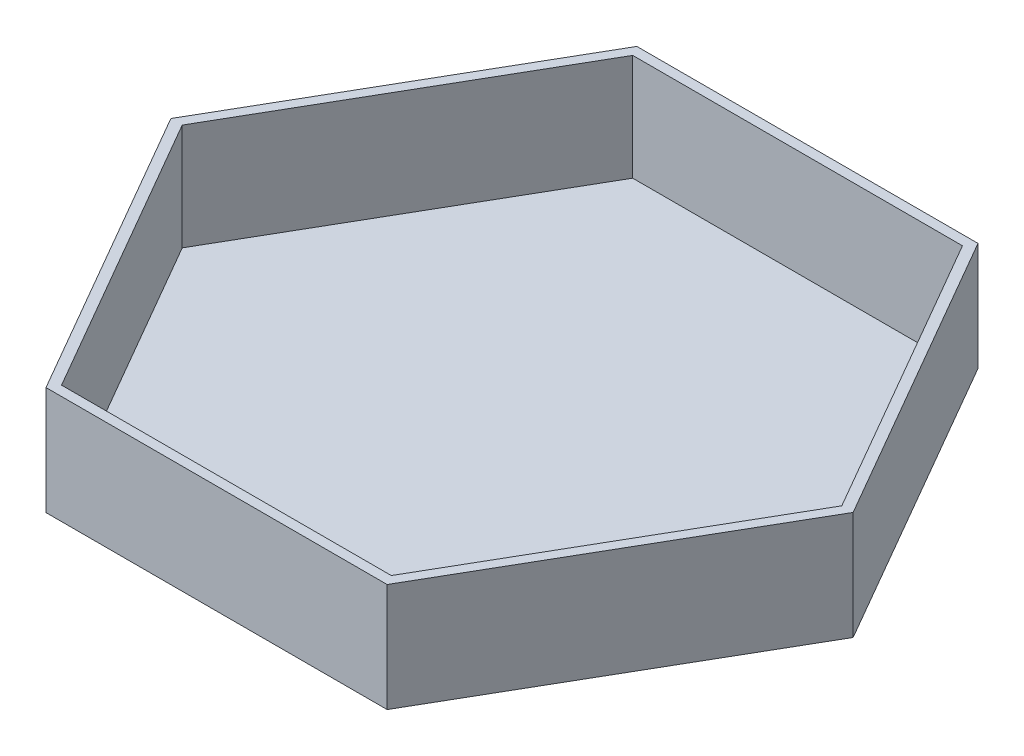
ISO-10303-21;
HEADER;
FILE_DESCRIPTION(('STEP AP214'),'2;1');
FILE_NAME('part.step','',(''),(''),'','','');
FILE_SCHEMA(('AUTOMOTIVE_DESIGN { 1 0 10303 214 1 1 1 1 }'));
ENDSEC;
DATA;
#1=APPLICATION_CONTEXT('core data for automotive mechanical design processes');
#2=APPLICATION_PROTOCOL_DEFINITION('international standard','automotive_design',2000,#1);
#3=PRODUCT_CONTEXT('',#1,'mechanical');
#4=PRODUCT('Part','Part','',(#3));
#5=PRODUCT_RELATED_PRODUCT_CATEGORY('part','',(#4));
#6=PRODUCT_DEFINITION_FORMATION('','',#4);
#7=PRODUCT_DEFINITION_CONTEXT('part definition',#1,'design');
#8=PRODUCT_DEFINITION('design','',#6,#7);
#9=PRODUCT_DEFINITION_SHAPE('','',#8);
#10=(LENGTH_UNIT() NAMED_UNIT(*) SI_UNIT(.MILLI.,.METRE.));
#11=(NAMED_UNIT(*) PLANE_ANGLE_UNIT() SI_UNIT($,.RADIAN.));
#12=(NAMED_UNIT(*) SI_UNIT($,.STERADIAN.) SOLID_ANGLE_UNIT());
#13=UNCERTAINTY_MEASURE_WITH_UNIT(LENGTH_MEASURE(1.E-05),#10,'distance_accuracy_value','');
#14=(GEOMETRIC_REPRESENTATION_CONTEXT(3) GLOBAL_UNCERTAINTY_ASSIGNED_CONTEXT((#13)) GLOBAL_UNIT_ASSIGNED_CONTEXT((#10,
#11,#12)) REPRESENTATION_CONTEXT('',''));
#15=CARTESIAN_POINT('',(0.,0.,0.));
#16=DIRECTION('',(0.,0.,1.));
#17=DIRECTION('',(1.,0.,0.));
#18=AXIS2_PLACEMENT_3D('',#15,#16,#17);
#19=CARTESIAN_POINT('',(86.6025403784452,55.,149.999999999998));
#20=DIRECTION('',(-0.866025403784441,0.,-0.499999999999995));
#21=DIRECTION('',(-0.499999999999995,0.,0.866025403784441));
#22=AXIS2_PLACEMENT_3D('',#19,#20,#21);
#23=PLANE('',#22);
#24=DIRECTION('',(0.499999999999995,0.,-0.866025403784441));
#25=VECTOR('',#24,1.);
#26=CARTESIAN_POINT('',(86.6025403784452,0.,149.999999999998));
#27=LINE('',#26,#25);
#28=CARTESIAN_POINT('',(86.6025403784452,0.,149.999999999998));
#29=VERTEX_POINT('',#28);
#30=CARTESIAN_POINT('',(173.205080756887,0.,0.));
#31=VERTEX_POINT('',#30);
#32=EDGE_CURVE('E145',#29,#31,#27,.T.);
#33=ORIENTED_EDGE('',*,*,#32,.T.);
#34=DIRECTION('',(0.,-1.,0.));
#35=VECTOR('',#34,1.);
#36=CARTESIAN_POINT('',(173.205080756887,55.,0.));
#37=LINE('',#36,#35);
#38=CARTESIAN_POINT('',(173.205080756887,55.,0.));
#39=VERTEX_POINT('',#38);
#40=EDGE_CURVE('E11',#39,#31,#37,.T.);
#41=ORIENTED_EDGE('',*,*,#40,.F.);
#42=DIRECTION('',(0.499999999999995,0.,-0.866025403784441));
#43=VECTOR('',#42,1.);
#44=CARTESIAN_POINT('',(86.6025403784452,55.,149.999999999998));
#45=LINE('',#44,#43);
#46=CARTESIAN_POINT('',(86.6025403784452,55.,149.999999999998));
#47=VERTEX_POINT('',#46);
#48=EDGE_CURVE('E163',#47,#39,#45,.T.);
#49=ORIENTED_EDGE('',*,*,#48,.F.);
#50=DIRECTION('',(0.,-1.,0.));
#51=VECTOR('',#50,1.);
#52=CARTESIAN_POINT('',(86.6025403784452,55.,149.999999999998));
#53=LINE('',#52,#51);
#54=EDGE_CURVE('E141',#47,#29,#53,.T.);
#55=ORIENTED_EDGE('',*,*,#54,.T.);
#56=EDGE_LOOP('',(#33,#41,#49,#55));
#57=FACE_BOUND('',#56,.T.);
#58=ADVANCED_FACE('F45',(#57),#23,.F.);
#59=CARTESIAN_POINT('',(173.205080756887,55.,0.));
#60=DIRECTION('',(-0.866025403784438,0.,0.500000000000001));
#61=DIRECTION('',(0.500000000000001,0.,0.866025403784438));
#62=AXIS2_PLACEMENT_3D('',#59,#60,#61);
#63=PLANE('',#62);
#64=DIRECTION('',(-0.500000000000001,0.,-0.866025403784438));
#65=VECTOR('',#64,1.);
#66=CARTESIAN_POINT('',(173.205080756887,0.,0.));
#67=LINE('',#66,#65);
#68=CARTESIAN_POINT('',(86.6025403784431,0.,-149.999999999999));
#69=VERTEX_POINT('',#68);
#70=EDGE_CURVE('E149',#31,#69,#67,.T.);
#71=ORIENTED_EDGE('',*,*,#70,.T.);
#72=DIRECTION('',(0.,-1.,0.));
#73=VECTOR('',#72,1.);
#74=CARTESIAN_POINT('',(86.6025403784431,55.,-149.999999999999));
#75=LINE('',#74,#73);
#76=CARTESIAN_POINT('',(86.6025403784431,55.,-149.999999999999));
#77=VERTEX_POINT('',#76);
#78=EDGE_CURVE('E53',#77,#69,#75,.T.);
#79=ORIENTED_EDGE('',*,*,#78,.F.);
#80=DIRECTION('',(-0.500000000000001,0.,-0.866025403784438));
#81=VECTOR('',#80,1.);
#82=CARTESIAN_POINT('',(173.205080756887,55.,0.));
#83=LINE('',#82,#81);
#84=EDGE_CURVE('E104',#39,#77,#83,.T.);
#85=ORIENTED_EDGE('',*,*,#84,.F.);
#86=ORIENTED_EDGE('',*,*,#40,.T.);
#87=EDGE_LOOP('',(#71,#79,#85,#86));
#88=FACE_BOUND('',#87,.T.);
#89=ADVANCED_FACE('F311',(#88),#63,.F.);
#90=CARTESIAN_POINT('',(86.6025403784431,55.,-149.999999999999));
#91=DIRECTION('',(0.,0.,1.));
#92=DIRECTION('',(1.,0.,0.));
#93=AXIS2_PLACEMENT_3D('',#90,#91,#92);
#94=PLANE('',#93);
#95=DIRECTION('',(-1.,0.,0.));
#96=VECTOR('',#95,1.);
#97=CARTESIAN_POINT('',(86.6025403784431,0.,-149.999999999999));
#98=LINE('',#97,#96);
#99=CARTESIAN_POINT('',(-86.6025403784441,0.,-149.999999999999));
#100=VERTEX_POINT('',#99);
#101=EDGE_CURVE('E153',#69,#100,#98,.T.);
#102=ORIENTED_EDGE('',*,*,#101,.T.);
#103=DIRECTION('',(0.,-1.,0.));
#104=VECTOR('',#103,1.);
#105=CARTESIAN_POINT('',(-86.6025403784441,55.,-149.999999999999));
#106=LINE('',#105,#104);
#107=CARTESIAN_POINT('',(-86.6025403784441,55.,-149.999999999999));
#108=VERTEX_POINT('',#107);
#109=EDGE_CURVE('E134',#108,#100,#106,.T.);
#110=ORIENTED_EDGE('',*,*,#109,.F.);
#111=DIRECTION('',(-1.,0.,0.));
#112=VECTOR('',#111,1.);
#113=CARTESIAN_POINT('',(86.6025403784431,55.,-149.999999999999));
#114=LINE('',#113,#112);
#115=EDGE_CURVE('E120',#77,#108,#114,.T.);
#116=ORIENTED_EDGE('',*,*,#115,.F.);
#117=ORIENTED_EDGE('',*,*,#78,.T.);
#118=EDGE_LOOP('',(#102,#110,#116,#117));
#119=FACE_BOUND('',#118,.T.);
#120=ADVANCED_FACE('F173',(#119),#94,.F.);
#121=CARTESIAN_POINT('',(-86.6025403784441,55.,-149.999999999999));
#122=DIRECTION('',(0.866025403784442,0.,0.499999999999995));
#123=DIRECTION('',(0.499999999999995,0.,-0.866025403784442));
#124=AXIS2_PLACEMENT_3D('',#121,#122,#123);
#125=PLANE('',#124);
#126=DIRECTION('',(-0.499999999999995,0.,0.866025403784442));
#127=VECTOR('',#126,1.);
#128=CARTESIAN_POINT('',(-86.6025403784441,0.,-149.999999999999));
#129=LINE('',#128,#127);
#130=CARTESIAN_POINT('',(-173.205080756887,0.,1.20948461451098E-12));
#131=VERTEX_POINT('',#130);
#132=EDGE_CURVE('E130',#100,#131,#129,.T.);
#133=ORIENTED_EDGE('',*,*,#132,.T.);
#134=DIRECTION('',(0.,-1.,0.));
#135=VECTOR('',#134,1.);
#136=CARTESIAN_POINT('',(-173.205080756887,55.,1.20948461451098E-12));
#137=LINE('',#136,#135);
#138=CARTESIAN_POINT('',(-173.205080756887,55.,1.20948461451098E-12));
#139=VERTEX_POINT('',#138);
#140=EDGE_CURVE('E127',#139,#131,#137,.T.);
#141=ORIENTED_EDGE('',*,*,#140,.F.);
#142=DIRECTION('',(-0.499999999999995,0.,0.866025403784442));
#143=VECTOR('',#142,1.);
#144=CARTESIAN_POINT('',(-86.6025403784441,55.,-149.999999999999));
#145=LINE('',#144,#143);
#146=EDGE_CURVE('E113',#108,#139,#145,.T.);
#147=ORIENTED_EDGE('',*,*,#146,.F.);
#148=ORIENTED_EDGE('',*,*,#109,.T.);
#149=EDGE_LOOP('',(#133,#141,#147,#148));
#150=FACE_BOUND('',#149,.T.);
#151=ADVANCED_FACE('F128',(#150),#125,.F.);
#152=CARTESIAN_POINT('',(-173.205080756887,55.,1.20948461451098E-12));
#153=DIRECTION('',(0.866025403784435,0.,-0.500000000000007));
#154=DIRECTION('',(-0.500000000000007,0.,-0.866025403784435));
#155=AXIS2_PLACEMENT_3D('',#152,#153,#154);
#156=PLANE('',#155);
#157=DIRECTION('',(0.500000000000007,0.,0.866025403784434));
#158=VECTOR('',#157,1.);
#159=CARTESIAN_POINT('',(-173.205080756887,0.,1.20948461451098E-12));
#160=LINE('',#159,#158);
#161=CARTESIAN_POINT('',(-86.602540378442,0.,150.));
#162=VERTEX_POINT('',#161);
#163=EDGE_CURVE('E158',#131,#162,#160,.T.);
#164=ORIENTED_EDGE('',*,*,#163,.T.);
#165=DIRECTION('',(0.,-1.,0.));
#166=VECTOR('',#165,1.);
#167=CARTESIAN_POINT('',(-86.602540378442,55.,150.));
#168=LINE('',#167,#166);
#169=CARTESIAN_POINT('',(-86.602540378442,55.,150.));
#170=VERTEX_POINT('',#169);
#171=EDGE_CURVE('E135',#170,#162,#168,.T.);
#172=ORIENTED_EDGE('',*,*,#171,.F.);
#173=DIRECTION('',(0.500000000000007,0.,0.866025403784434));
#174=VECTOR('',#173,1.);
#175=CARTESIAN_POINT('',(-173.205080756887,55.,1.20948461451098E-12));
#176=LINE('',#175,#174);
#177=EDGE_CURVE('E117',#139,#170,#176,.T.);
#178=ORIENTED_EDGE('',*,*,#177,.F.);
#179=ORIENTED_EDGE('',*,*,#140,.T.);
#180=EDGE_LOOP('',(#164,#172,#178,#179));
#181=FACE_BOUND('',#180,.T.);
#182=ADVANCED_FACE('F137',(#181),#156,.F.);
#183=CARTESIAN_POINT('',(-86.602540378442,55.,150.));
#184=DIRECTION('',(0.,0.,-1.));
#185=DIRECTION('',(-1.,0.,0.));
#186=AXIS2_PLACEMENT_3D('',#183,#184,#185);
#187=PLANE('',#186);
#188=DIRECTION('',(1.,0.,0.));
#189=VECTOR('',#188,1.);
#190=CARTESIAN_POINT('',(-86.602540378442,0.,150.));
#191=LINE('',#190,#189);
#192=EDGE_CURVE('E96',#162,#29,#191,.T.);
#193=ORIENTED_EDGE('',*,*,#192,.T.);
#194=ORIENTED_EDGE('',*,*,#54,.F.);
#195=DIRECTION('',(1.,0.,0.));
#196=VECTOR('',#195,1.);
#197=CARTESIAN_POINT('',(-86.602540378442,55.,150.));
#198=LINE('',#197,#196);
#199=EDGE_CURVE('E69',#170,#47,#198,.T.);
#200=ORIENTED_EDGE('',*,*,#199,.F.);
#201=ORIENTED_EDGE('',*,*,#171,.T.);
#202=EDGE_LOOP('',(#193,#194,#200,#201));
#203=FACE_BOUND('',#202,.T.);
#204=ADVANCED_FACE('F177',(#203),#187,.F.);
#205=CARTESIAN_POINT('',(0.,55.,0.));
#206=DIRECTION('',(0.,1.,0.));
#207=DIRECTION('',(0.,0.,1.));
#208=AXIS2_PLACEMENT_3D('',#205,#206,#207);
#209=PLANE('',#208);
#210=DIRECTION('',(0.499999999999995,0.,-0.866025403784441));
#211=VECTOR('',#210,1.);
#212=CARTESIAN_POINT('',(82.272413359523,55.,147.499999999998));
#213=LINE('',#212,#211);
#214=CARTESIAN_POINT('',(83.715789032497,55.,144.999999999998));
#215=VERTEX_POINT('',#214);
#216=CARTESIAN_POINT('',(167.431578064991,55.,0.));
#217=VERTEX_POINT('',#216);
#218=EDGE_CURVE('E206',#215,#217,#213,.T.);
#219=ORIENTED_EDGE('',*,*,#218,.F.);
#220=DIRECTION('',(1.,0.,0.));
#221=VECTOR('',#220,1.);
#222=CARTESIAN_POINT('',(-86.6025403784421,55.,145.));
#223=LINE('',#222,#221);
#224=CARTESIAN_POINT('',(-83.7157890324939,55.,145.));
#225=VERTEX_POINT('',#224);
#226=EDGE_CURVE('E186',#225,#215,#223,.T.);
#227=ORIENTED_EDGE('',*,*,#226,.F.);
#228=DIRECTION('',(0.500000000000007,0.,0.866025403784435));
#229=VECTOR('',#228,1.);
#230=CARTESIAN_POINT('',(-168.874953737965,55.,-2.49999999999883));
#231=LINE('',#230,#229);
#232=CARTESIAN_POINT('',(-167.431578064991,55.,1.16718257997615E-12));
#233=VERTEX_POINT('',#232);
#234=EDGE_CURVE('E191',#233,#225,#231,.T.);
#235=ORIENTED_EDGE('',*,*,#234,.F.);
#236=DIRECTION('',(-0.499999999999995,0.,0.866025403784442));
#237=VECTOR('',#236,1.);
#238=CARTESIAN_POINT('',(-82.2724133595219,55.,-147.499999999999));
#239=LINE('',#238,#237);
#240=CARTESIAN_POINT('',(-83.7157890324959,55.,-144.999999999999));
#241=VERTEX_POINT('',#240);
#242=EDGE_CURVE('E194',#241,#233,#239,.T.);
#243=ORIENTED_EDGE('',*,*,#242,.F.);
#244=DIRECTION('',(-1.,0.,0.));
#245=VECTOR('',#244,1.);
#246=CARTESIAN_POINT('',(86.6025403784431,55.,-144.999999999999));
#247=LINE('',#246,#245);
#248=CARTESIAN_POINT('',(83.7157890324949,55.,-144.999999999999));
#249=VERTEX_POINT('',#248);
#250=EDGE_CURVE('E198',#249,#241,#247,.T.);
#251=ORIENTED_EDGE('',*,*,#250,.F.);
#252=DIRECTION('',(-0.500000000000001,0.,-0.866025403784438));
#253=VECTOR('',#252,1.);
#254=CARTESIAN_POINT('',(168.874953737965,55.,2.50000000000001));
#255=LINE('',#254,#253);
#256=EDGE_CURVE('E202',#217,#249,#255,.T.);
#257=ORIENTED_EDGE('',*,*,#256,.F.);
#258=EDGE_LOOP('',(#219,#227,#235,#243,#251,#257));
#259=FACE_BOUND('',#258,.T.);
#260=ORIENTED_EDGE('',*,*,#48,.T.);
#261=ORIENTED_EDGE('',*,*,#84,.T.);
#262=ORIENTED_EDGE('',*,*,#115,.T.);
#263=ORIENTED_EDGE('',*,*,#146,.T.);
#264=ORIENTED_EDGE('',*,*,#177,.T.);
#265=ORIENTED_EDGE('',*,*,#199,.T.);
#266=EDGE_LOOP('',(#260,#261,#262,#263,#264,#265));
#267=FACE_BOUND('',#266,.T.);
#268=ADVANCED_FACE('F115',(#259,#267),#209,.T.);
#269=CARTESIAN_POINT('',(0.,0.,0.));
#270=DIRECTION('',(0.,1.,0.));
#271=DIRECTION('',(0.,0.,1.));
#272=AXIS2_PLACEMENT_3D('',#269,#270,#271);
#273=PLANE('',#272);
#274=ORIENTED_EDGE('',*,*,#32,.F.);
#275=ORIENTED_EDGE('',*,*,#192,.F.);
#276=ORIENTED_EDGE('',*,*,#163,.F.);
#277=ORIENTED_EDGE('',*,*,#132,.F.);
#278=ORIENTED_EDGE('',*,*,#101,.F.);
#279=ORIENTED_EDGE('',*,*,#70,.F.);
#280=EDGE_LOOP('',(#274,#275,#276,#277,#278,#279));
#281=FACE_BOUND('',#280,.T.);
#282=ADVANCED_FACE('F176',(#281),#273,.F.);
#283=CARTESIAN_POINT('',(82.272413359523,55.,147.499999999998));
#284=DIRECTION('',(-0.866025403784441,0.,-0.499999999999995));
#285=DIRECTION('',(-0.499999999999995,0.,0.866025403784441));
#286=AXIS2_PLACEMENT_3D('',#283,#284,#285);
#287=PLANE('',#286);
#288=DIRECTION('',(0.499999999999995,0.,-0.866025403784441));
#289=VECTOR('',#288,1.);
#290=CARTESIAN_POINT('',(82.272413359523,1.,147.499999999998));
#291=LINE('',#290,#289);
#292=CARTESIAN_POINT('',(83.715789032497,1.,144.999999999998));
#293=VERTEX_POINT('',#292);
#294=CARTESIAN_POINT('',(167.431578064991,1.,0.));
#295=VERTEX_POINT('',#294);
#296=EDGE_CURVE('E244',#293,#295,#291,.T.);
#297=ORIENTED_EDGE('',*,*,#296,.F.);
#298=DIRECTION('',(0.,-1.,0.));
#299=VECTOR('',#298,1.);
#300=CARTESIAN_POINT('',(83.715789032497,55.,144.999999999998));
#301=LINE('',#300,#299);
#302=EDGE_CURVE('E190',#215,#293,#301,.T.);
#303=ORIENTED_EDGE('',*,*,#302,.F.);
#304=ORIENTED_EDGE('',*,*,#218,.T.);
#305=DIRECTION('',(0.,-1.,0.));
#306=VECTOR('',#305,1.);
#307=CARTESIAN_POINT('',(167.431578064991,55.,0.));
#308=LINE('',#307,#306);
#309=EDGE_CURVE('E150',#217,#295,#308,.T.);
#310=ORIENTED_EDGE('',*,*,#309,.T.);
#311=EDGE_LOOP('',(#297,#303,#304,#310));
#312=FACE_BOUND('',#311,.T.);
#313=ADVANCED_FACE('F263',(#312),#287,.T.);
#314=CARTESIAN_POINT('',(168.874953737965,55.,2.50000000000001));
#315=DIRECTION('',(-0.866025403784438,0.,0.500000000000001));
#316=DIRECTION('',(0.500000000000001,0.,0.866025403784438));
#317=AXIS2_PLACEMENT_3D('',#314,#315,#316);
#318=PLANE('',#317);
#319=DIRECTION('',(-0.500000000000001,0.,-0.866025403784438));
#320=VECTOR('',#319,1.);
#321=CARTESIAN_POINT('',(168.874953737965,1.,2.50000000000001));
#322=LINE('',#321,#320);
#323=CARTESIAN_POINT('',(83.7157890324949,1.,-144.999999999999));
#324=VERTEX_POINT('',#323);
#325=EDGE_CURVE('E237',#295,#324,#322,.T.);
#326=ORIENTED_EDGE('',*,*,#325,.F.);
#327=ORIENTED_EDGE('',*,*,#309,.F.);
#328=ORIENTED_EDGE('',*,*,#256,.T.);
#329=DIRECTION('',(0.,-1.,0.));
#330=VECTOR('',#329,1.);
#331=CARTESIAN_POINT('',(83.715789032495,55.,-144.999999999999));
#332=LINE('',#331,#330);
#333=EDGE_CURVE('E233',#249,#324,#332,.T.);
#334=ORIENTED_EDGE('',*,*,#333,.T.);
#335=EDGE_LOOP('',(#326,#327,#328,#334));
#336=FACE_BOUND('',#335,.T.);
#337=ADVANCED_FACE('F289',(#336),#318,.T.);
#338=CARTESIAN_POINT('',(86.6025403784431,55.,-144.999999999999));
#339=DIRECTION('',(0.,0.,1.));
#340=DIRECTION('',(1.,0.,0.));
#341=AXIS2_PLACEMENT_3D('',#338,#339,#340);
#342=PLANE('',#341);
#343=DIRECTION('',(-1.,0.,0.));
#344=VECTOR('',#343,1.);
#345=CARTESIAN_POINT('',(86.6025403784431,1.,-144.999999999999));
#346=LINE('',#345,#344);
#347=CARTESIAN_POINT('',(-83.7157890324959,1.,-144.999999999999));
#348=VERTEX_POINT('',#347);
#349=EDGE_CURVE('E229',#324,#348,#346,.T.);
#350=ORIENTED_EDGE('',*,*,#349,.F.);
#351=ORIENTED_EDGE('',*,*,#333,.F.);
#352=ORIENTED_EDGE('',*,*,#250,.T.);
#353=DIRECTION('',(0.,-1.,0.));
#354=VECTOR('',#353,1.);
#355=CARTESIAN_POINT('',(-83.7157890324959,55.,-144.999999999999));
#356=LINE('',#355,#354);
#357=EDGE_CURVE('E225',#241,#348,#356,.T.);
#358=ORIENTED_EDGE('',*,*,#357,.T.);
#359=EDGE_LOOP('',(#350,#351,#352,#358));
#360=FACE_BOUND('',#359,.T.);
#361=ADVANCED_FACE('F295',(#360),#342,.T.);
#362=CARTESIAN_POINT('',(-82.2724133595219,55.,-147.499999999999));
#363=DIRECTION('',(0.866025403784442,0.,0.499999999999995));
#364=DIRECTION('',(0.499999999999995,0.,-0.866025403784442));
#365=AXIS2_PLACEMENT_3D('',#362,#363,#364);
#366=PLANE('',#365);
#367=DIRECTION('',(-0.499999999999995,0.,0.866025403784442));
#368=VECTOR('',#367,1.);
#369=CARTESIAN_POINT('',(-82.2724133595219,1.,-147.499999999999));
#370=LINE('',#369,#368);
#371=CARTESIAN_POINT('',(-167.431578064991,1.,1.16718257997615E-12));
#372=VERTEX_POINT('',#371);
#373=EDGE_CURVE('E221',#348,#372,#370,.T.);
#374=ORIENTED_EDGE('',*,*,#373,.F.);
#375=ORIENTED_EDGE('',*,*,#357,.F.);
#376=ORIENTED_EDGE('',*,*,#242,.T.);
#377=DIRECTION('',(0.,-1.,0.));
#378=VECTOR('',#377,1.);
#379=CARTESIAN_POINT('',(-167.431578064991,55.,1.16183104803547E-12));
#380=LINE('',#379,#378);
#381=EDGE_CURVE('E217',#233,#372,#380,.T.);
#382=ORIENTED_EDGE('',*,*,#381,.T.);
#383=EDGE_LOOP('',(#374,#375,#376,#382));
#384=FACE_BOUND('',#383,.T.);
#385=ADVANCED_FACE('F299',(#384),#366,.T.);
#386=CARTESIAN_POINT('',(-168.874953737965,55.,-2.49999999999883));
#387=DIRECTION('',(0.866025403784435,0.,-0.500000000000007));
#388=DIRECTION('',(-0.500000000000007,0.,-0.866025403784435));
#389=AXIS2_PLACEMENT_3D('',#386,#387,#388);
#390=PLANE('',#389);
#391=DIRECTION('',(0.500000000000007,0.,0.866025403784435));
#392=VECTOR('',#391,1.);
#393=CARTESIAN_POINT('',(-168.874953737965,1.,-2.49999999999883));
#394=LINE('',#393,#392);
#395=CARTESIAN_POINT('',(-83.7157890324939,1.,145.));
#396=VERTEX_POINT('',#395);
#397=EDGE_CURVE('E214',#372,#396,#394,.T.);
#398=ORIENTED_EDGE('',*,*,#397,.F.);
#399=ORIENTED_EDGE('',*,*,#381,.F.);
#400=ORIENTED_EDGE('',*,*,#234,.T.);
#401=DIRECTION('',(0.,-1.,0.));
#402=VECTOR('',#401,1.);
#403=CARTESIAN_POINT('',(-83.7157890324939,55.,145.));
#404=LINE('',#403,#402);
#405=EDGE_CURVE('E60',#225,#396,#404,.T.);
#406=ORIENTED_EDGE('',*,*,#405,.T.);
#407=EDGE_LOOP('',(#398,#399,#400,#406));
#408=FACE_BOUND('',#407,.T.);
#409=ADVANCED_FACE('F301',(#408),#390,.T.);
#410=CARTESIAN_POINT('',(-86.6025403784421,55.,145.));
#411=DIRECTION('',(0.,0.,-1.));
#412=DIRECTION('',(-1.,0.,0.));
#413=AXIS2_PLACEMENT_3D('',#410,#411,#412);
#414=PLANE('',#413);
#415=DIRECTION('',(1.,0.,0.));
#416=VECTOR('',#415,1.);
#417=CARTESIAN_POINT('',(-86.6025403784421,1.,145.));
#418=LINE('',#417,#416);
#419=EDGE_CURVE('E210',#396,#293,#418,.T.);
#420=ORIENTED_EDGE('',*,*,#419,.F.);
#421=ORIENTED_EDGE('',*,*,#405,.F.);
#422=ORIENTED_EDGE('',*,*,#226,.T.);
#423=ORIENTED_EDGE('',*,*,#302,.T.);
#424=EDGE_LOOP('',(#420,#421,#422,#423));
#425=FACE_BOUND('',#424,.T.);
#426=ADVANCED_FACE('F283',(#425),#414,.T.);
#427=CARTESIAN_POINT('',(0.,1.,0.));
#428=DIRECTION('',(0.,1.,0.));
#429=DIRECTION('',(0.,0.,1.));
#430=AXIS2_PLACEMENT_3D('',#427,#428,#429);
#431=PLANE('',#430);
#432=ORIENTED_EDGE('',*,*,#296,.T.);
#433=ORIENTED_EDGE('',*,*,#325,.T.);
#434=ORIENTED_EDGE('',*,*,#349,.T.);
#435=ORIENTED_EDGE('',*,*,#373,.T.);
#436=ORIENTED_EDGE('',*,*,#397,.T.);
#437=ORIENTED_EDGE('',*,*,#419,.T.);
#438=EDGE_LOOP('',(#432,#433,#434,#435,#436,#437));
#439=FACE_BOUND('',#438,.T.);
#440=ADVANCED_FACE('F256',(#439),#431,.T.);
#441=CLOSED_SHELL('',(#58,#89,#120,#151,#182,#204,#268,#282,#313,#337,#361,#385,#409,#426,#440));
#442=MANIFOLD_SOLID_BREP('B2',#441);
#443=ADVANCED_BREP_SHAPE_REPRESENTATION('',(#18,#442),#14);
#444=SHAPE_DEFINITION_REPRESENTATION(#9,#443);
ENDSEC;
END-ISO-10303-21;
